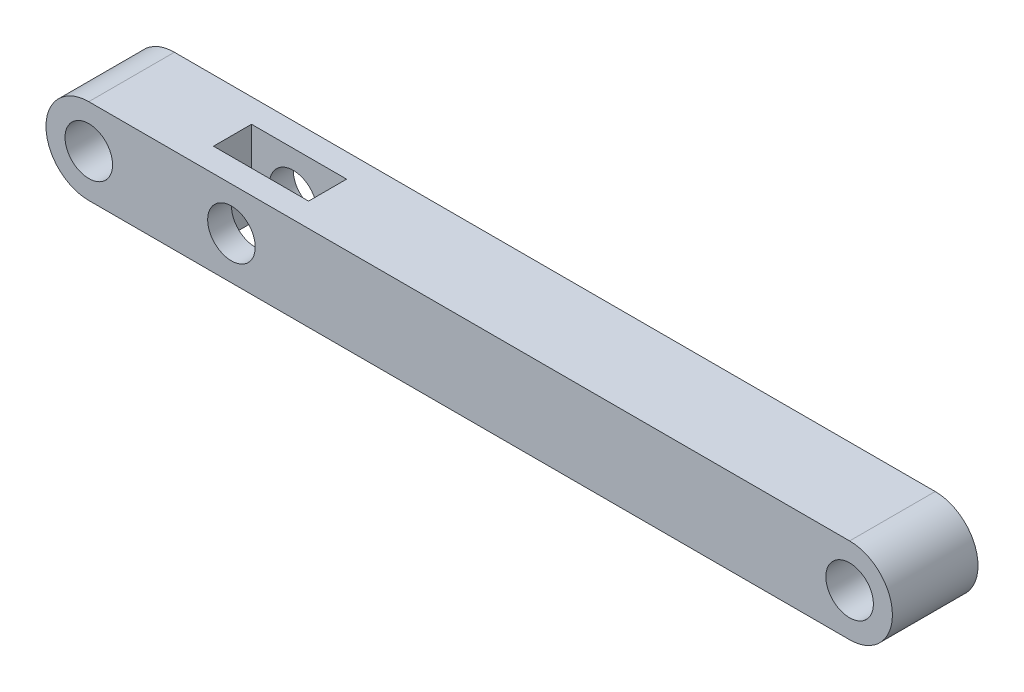
ISO-10303-21;
HEADER;
FILE_DESCRIPTION(('STEP AP214'),'2;1');
FILE_NAME('part.step','',(''),(''),'','','');
FILE_SCHEMA(('AUTOMOTIVE_DESIGN { 1 0 10303 214 1 1 1 1 }'));
ENDSEC;
DATA;
#1=APPLICATION_CONTEXT('core data for automotive mechanical design processes');
#2=APPLICATION_PROTOCOL_DEFINITION('international standard','automotive_design',2000,#1);
#3=PRODUCT_CONTEXT('',#1,'mechanical');
#4=PRODUCT('Part','Part','',(#3));
#5=PRODUCT_RELATED_PRODUCT_CATEGORY('part','',(#4));
#6=PRODUCT_DEFINITION_FORMATION('','',#4);
#7=PRODUCT_DEFINITION_CONTEXT('part definition',#1,'design');
#8=PRODUCT_DEFINITION('design','',#6,#7);
#9=PRODUCT_DEFINITION_SHAPE('','',#8);
#10=(LENGTH_UNIT() NAMED_UNIT(*) SI_UNIT(.MILLI.,.METRE.));
#11=(NAMED_UNIT(*) PLANE_ANGLE_UNIT() SI_UNIT($,.RADIAN.));
#12=(NAMED_UNIT(*) SI_UNIT($,.STERADIAN.) SOLID_ANGLE_UNIT());
#13=UNCERTAINTY_MEASURE_WITH_UNIT(LENGTH_MEASURE(1.E-05),#10,'distance_accuracy_value','');
#14=(GEOMETRIC_REPRESENTATION_CONTEXT(3) GLOBAL_UNCERTAINTY_ASSIGNED_CONTEXT((#13)) GLOBAL_UNIT_ASSIGNED_CONTEXT((#10,
#11,#12)) REPRESENTATION_CONTEXT('',''));
#15=CARTESIAN_POINT('',(0.,0.,0.));
#16=DIRECTION('',(0.,0.,1.));
#17=DIRECTION('',(1.,0.,0.));
#18=AXIS2_PLACEMENT_3D('',#15,#16,#17);
#19=CARTESIAN_POINT('',(0.,0.,18.));
#20=DIRECTION('',(0.,0.,-1.));
#21=DIRECTION('',(-1.,0.,0.));
#22=AXIS2_PLACEMENT_3D('',#19,#20,#21);
#23=CYLINDRICAL_SURFACE('',#22,5.);
#24=CARTESIAN_POINT('',(0.,0.,5.));
#25=DIRECTION('',(0.,0.,-1.));
#26=DIRECTION('',(-1.,0.,0.));
#27=AXIS2_PLACEMENT_3D('',#24,#25,#26);
#28=CIRCLE('',#27,5.);
#29=CARTESIAN_POINT('',(-5.,0.,5.));
#30=VERTEX_POINT('',#29);
#31=EDGE_CURVE('E36',#30,#30,#28,.T.);
#32=ORIENTED_EDGE('',*,*,#31,.F.);
#33=EDGE_LOOP('',(#32));
#34=FACE_BOUND('',#33,.T.);
#35=CARTESIAN_POINT('',(0.,0.,0.));
#36=DIRECTION('',(0.,0.,1.));
#37=DIRECTION('',(1.,0.,0.));
#38=AXIS2_PLACEMENT_3D('',#35,#36,#37);
#39=CIRCLE('',#38,5.);
#40=CARTESIAN_POINT('',(5.,0.,0.));
#41=VERTEX_POINT('',#40);
#42=EDGE_CURVE('E146',#41,#41,#39,.T.);
#43=ORIENTED_EDGE('',*,*,#42,.F.);
#44=EDGE_LOOP('',(#43));
#45=FACE_BOUND('',#44,.T.);
#46=ADVANCED_FACE('F32',(#34,#45),#23,.F.);
#47=CARTESIAN_POINT('',(-30.,0.,18.));
#48=DIRECTION('',(0.,0.,1.));
#49=DIRECTION('',(1.,0.,0.));
#50=AXIS2_PLACEMENT_3D('',#47,#48,#49);
#51=PLANE('',#50);
#52=CARTESIAN_POINT('',(130.,0.,18.));
#53=DIRECTION('',(0.,0.,1.));
#54=DIRECTION('',(1.,0.,0.));
#55=AXIS2_PLACEMENT_3D('',#52,#53,#54);
#56=CIRCLE('',#55,4.99999999999999);
#57=CARTESIAN_POINT('',(135.,0.,18.));
#58=VERTEX_POINT('',#57);
#59=EDGE_CURVE('E143',#58,#58,#56,.T.);
#60=ORIENTED_EDGE('',*,*,#59,.F.);
#61=EDGE_LOOP('',(#60));
#62=FACE_BOUND('',#61,.T.);
#63=CARTESIAN_POINT('',(-30.,0.,18.));
#64=DIRECTION('',(0.,0.,1.));
#65=DIRECTION('',(1.,0.,0.));
#66=AXIS2_PLACEMENT_3D('',#63,#64,#65);
#67=CIRCLE('',#66,9.);
#68=CARTESIAN_POINT('',(-30.,9.,18.));
#69=VERTEX_POINT('',#68);
#70=CARTESIAN_POINT('',(-30.,-9.,18.));
#71=VERTEX_POINT('',#70);
#72=EDGE_CURVE('E155',#69,#71,#67,.T.);
#73=ORIENTED_EDGE('',*,*,#72,.T.);
#74=DIRECTION('',(1.,0.,0.));
#75=VECTOR('',#74,1.);
#76=CARTESIAN_POINT('',(130.,-9.,18.));
#77=LINE('',#76,#75);
#78=CARTESIAN_POINT('',(130.,-9.,18.));
#79=VERTEX_POINT('',#78);
#80=EDGE_CURVE('E158',#71,#79,#77,.T.);
#81=ORIENTED_EDGE('',*,*,#80,.T.);
#82=CARTESIAN_POINT('',(130.,0.,18.));
#83=DIRECTION('',(0.,0.,1.));
#84=DIRECTION('',(1.,0.,0.));
#85=AXIS2_PLACEMENT_3D('',#82,#83,#84);
#86=CIRCLE('',#85,9.);
#87=CARTESIAN_POINT('',(130.,9.,18.));
#88=VERTEX_POINT('',#87);
#89=EDGE_CURVE('E161',#79,#88,#86,.T.);
#90=ORIENTED_EDGE('',*,*,#89,.T.);
#91=DIRECTION('',(-1.,0.,0.));
#92=VECTOR('',#91,1.);
#93=CARTESIAN_POINT('',(-30.,9.,18.));
#94=LINE('',#93,#92);
#95=EDGE_CURVE('E163',#88,#69,#94,.T.);
#96=ORIENTED_EDGE('',*,*,#95,.T.);
#97=EDGE_LOOP('',(#73,#81,#90,#96));
#98=FACE_BOUND('',#97,.T.);
#99=CARTESIAN_POINT('',(0.,0.,18.));
#100=DIRECTION('',(0.,0.,1.));
#101=DIRECTION('',(1.,0.,0.));
#102=AXIS2_PLACEMENT_3D('',#99,#100,#101);
#103=CIRCLE('',#102,5.);
#104=CARTESIAN_POINT('',(5.,0.,18.));
#105=VERTEX_POINT('',#104);
#106=EDGE_CURVE('E149',#105,#105,#103,.T.);
#107=ORIENTED_EDGE('',*,*,#106,.F.);
#108=EDGE_LOOP('',(#107));
#109=FACE_BOUND('',#108,.T.);
#110=CARTESIAN_POINT('',(-30.,0.,18.));
#111=DIRECTION('',(0.,0.,1.));
#112=DIRECTION('',(1.,0.,0.));
#113=AXIS2_PLACEMENT_3D('',#110,#111,#112);
#114=CIRCLE('',#113,5.);
#115=CARTESIAN_POINT('',(-25.,0.,18.));
#116=VERTEX_POINT('',#115);
#117=EDGE_CURVE('E136',#116,#116,#114,.T.);
#118=ORIENTED_EDGE('',*,*,#117,.F.);
#119=EDGE_LOOP('',(#118));
#120=FACE_BOUND('',#119,.T.);
#121=ADVANCED_FACE('F190',(#62,#98,#109,#120),#51,.T.);
#122=CARTESIAN_POINT('',(-30.,0.,0.));
#123=DIRECTION('',(0.,0.,1.));
#124=DIRECTION('',(1.,0.,0.));
#125=AXIS2_PLACEMENT_3D('',#122,#123,#124);
#126=PLANE('',#125);
#127=CARTESIAN_POINT('',(130.,0.,0.));
#128=DIRECTION('',(0.,0.,1.));
#129=DIRECTION('',(1.,0.,0.));
#130=AXIS2_PLACEMENT_3D('',#127,#128,#129);
#131=CIRCLE('',#130,4.99999999999999);
#132=CARTESIAN_POINT('',(135.,0.,0.));
#133=VERTEX_POINT('',#132);
#134=EDGE_CURVE('E139',#133,#133,#131,.T.);
#135=ORIENTED_EDGE('',*,*,#134,.T.);
#136=EDGE_LOOP('',(#135));
#137=FACE_BOUND('',#136,.T.);
#138=CARTESIAN_POINT('',(-30.,0.,0.));
#139=DIRECTION('',(0.,0.,1.));
#140=DIRECTION('',(1.,0.,0.));
#141=AXIS2_PLACEMENT_3D('',#138,#139,#140);
#142=CIRCLE('',#141,9.);
#143=CARTESIAN_POINT('',(-30.,9.,0.));
#144=VERTEX_POINT('',#143);
#145=CARTESIAN_POINT('',(-30.,-9.,0.));
#146=VERTEX_POINT('',#145);
#147=EDGE_CURVE('E152',#144,#146,#142,.T.);
#148=ORIENTED_EDGE('',*,*,#147,.F.);
#149=DIRECTION('',(-1.,0.,0.));
#150=VECTOR('',#149,1.);
#151=CARTESIAN_POINT('',(-30.,9.,0.));
#152=LINE('',#151,#150);
#153=CARTESIAN_POINT('',(130.,9.,0.));
#154=VERTEX_POINT('',#153);
#155=EDGE_CURVE('E159',#154,#144,#152,.T.);
#156=ORIENTED_EDGE('',*,*,#155,.F.);
#157=CARTESIAN_POINT('',(130.,0.,0.));
#158=DIRECTION('',(0.,0.,1.));
#159=DIRECTION('',(1.,0.,0.));
#160=AXIS2_PLACEMENT_3D('',#157,#158,#159);
#161=CIRCLE('',#160,9.);
#162=CARTESIAN_POINT('',(130.,-9.,0.));
#163=VERTEX_POINT('',#162);
#164=EDGE_CURVE('E170',#163,#154,#161,.T.);
#165=ORIENTED_EDGE('',*,*,#164,.F.);
#166=DIRECTION('',(1.,0.,0.));
#167=VECTOR('',#166,1.);
#168=CARTESIAN_POINT('',(130.,-9.,0.));
#169=LINE('',#168,#167);
#170=EDGE_CURVE('E168',#146,#163,#169,.T.);
#171=ORIENTED_EDGE('',*,*,#170,.F.);
#172=EDGE_LOOP('',(#148,#156,#165,#171));
#173=FACE_BOUND('',#172,.T.);
#174=ORIENTED_EDGE('',*,*,#42,.T.);
#175=EDGE_LOOP('',(#174));
#176=FACE_BOUND('',#175,.T.);
#177=CARTESIAN_POINT('',(-30.,0.,0.));
#178=DIRECTION('',(0.,0.,1.));
#179=DIRECTION('',(1.,0.,0.));
#180=AXIS2_PLACEMENT_3D('',#177,#178,#179);
#181=CIRCLE('',#180,5.);
#182=CARTESIAN_POINT('',(-25.,0.,0.));
#183=VERTEX_POINT('',#182);
#184=EDGE_CURVE('E140',#183,#183,#181,.T.);
#185=ORIENTED_EDGE('',*,*,#184,.T.);
#186=EDGE_LOOP('',(#185));
#187=FACE_BOUND('',#186,.T.);
#188=ADVANCED_FACE('F195',(#137,#173,#176,#187),#126,.F.);
#189=CARTESIAN_POINT('',(-30.,0.,18.));
#190=DIRECTION('',(0.,0.,-1.));
#191=DIRECTION('',(-1.,0.,0.));
#192=AXIS2_PLACEMENT_3D('',#189,#190,#191);
#193=CYLINDRICAL_SURFACE('',#192,9.);
#194=ORIENTED_EDGE('',*,*,#147,.T.);
#195=DIRECTION('',(0.,0.,-1.));
#196=VECTOR('',#195,1.);
#197=CARTESIAN_POINT('',(-30.,-9.,18.));
#198=LINE('',#197,#196);
#199=EDGE_CURVE('E11',#71,#146,#198,.T.);
#200=ORIENTED_EDGE('',*,*,#199,.F.);
#201=ORIENTED_EDGE('',*,*,#72,.F.);
#202=DIRECTION('',(0.,0.,-1.));
#203=VECTOR('',#202,1.);
#204=CARTESIAN_POINT('',(-30.,9.,18.));
#205=LINE('',#204,#203);
#206=EDGE_CURVE('E165',#69,#144,#205,.T.);
#207=ORIENTED_EDGE('',*,*,#206,.T.);
#208=EDGE_LOOP('',(#194,#200,#201,#207));
#209=FACE_BOUND('',#208,.T.);
#210=ADVANCED_FACE('F34',(#209),#193,.T.);
#211=CARTESIAN_POINT('',(130.,-9.,18.));
#212=DIRECTION('',(0.,1.,0.));
#213=DIRECTION('',(0.,0.,1.));
#214=AXIS2_PLACEMENT_3D('',#211,#212,#213);
#215=PLANE('',#214);
#216=DIRECTION('',(-1.,0.,0.));
#217=VECTOR('',#216,1.);
#218=CARTESIAN_POINT('',(-8.77792051619153,-9.,5.));
#219=LINE('',#218,#217);
#220=CARTESIAN_POINT('',(11.2220794838085,-9.,5.));
#221=VERTEX_POINT('',#220);
#222=CARTESIAN_POINT('',(-8.77792051619153,-9.,5.));
#223=VERTEX_POINT('',#222);
#224=EDGE_CURVE('E107',#221,#223,#219,.T.);
#225=ORIENTED_EDGE('',*,*,#224,.T.);
#226=DIRECTION('',(0.,0.,1.));
#227=VECTOR('',#226,1.);
#228=CARTESIAN_POINT('',(-8.77792051619153,-9.,5.));
#229=LINE('',#228,#227);
#230=CARTESIAN_POINT('',(-8.77792051619153,-9.,13.));
#231=VERTEX_POINT('',#230);
#232=EDGE_CURVE('E101',#223,#231,#229,.T.);
#233=ORIENTED_EDGE('',*,*,#232,.T.);
#234=DIRECTION('',(1.,0.,0.));
#235=VECTOR('',#234,1.);
#236=CARTESIAN_POINT('',(-8.77792051619153,-9.,13.));
#237=LINE('',#236,#235);
#238=CARTESIAN_POINT('',(11.2220794838085,-9.,13.));
#239=VERTEX_POINT('',#238);
#240=EDGE_CURVE('E110',#231,#239,#237,.T.);
#241=ORIENTED_EDGE('',*,*,#240,.T.);
#242=DIRECTION('',(0.,0.,-1.));
#243=VECTOR('',#242,1.);
#244=CARTESIAN_POINT('',(11.2220794838085,-9.,5.));
#245=LINE('',#244,#243);
#246=EDGE_CURVE('E49',#239,#221,#245,.T.);
#247=ORIENTED_EDGE('',*,*,#246,.T.);
#248=EDGE_LOOP('',(#225,#233,#241,#247));
#249=FACE_BOUND('',#248,.T.);
#250=ORIENTED_EDGE('',*,*,#170,.T.);
#251=DIRECTION('',(0.,0.,-1.));
#252=VECTOR('',#251,1.);
#253=CARTESIAN_POINT('',(130.,-9.,18.));
#254=LINE('',#253,#252);
#255=EDGE_CURVE('E41',#79,#163,#254,.T.);
#256=ORIENTED_EDGE('',*,*,#255,.F.);
#257=ORIENTED_EDGE('',*,*,#80,.F.);
#258=ORIENTED_EDGE('',*,*,#199,.T.);
#259=EDGE_LOOP('',(#250,#256,#257,#258));
#260=FACE_BOUND('',#259,.T.);
#261=ADVANCED_FACE('F114',(#249,#260),#215,.F.);
#262=CARTESIAN_POINT('',(130.,0.,18.));
#263=DIRECTION('',(0.,0.,-1.));
#264=DIRECTION('',(-1.,0.,0.));
#265=AXIS2_PLACEMENT_3D('',#262,#263,#264);
#266=CYLINDRICAL_SURFACE('',#265,9.);
#267=ORIENTED_EDGE('',*,*,#164,.T.);
#268=DIRECTION('',(0.,0.,-1.));
#269=VECTOR('',#268,1.);
#270=CARTESIAN_POINT('',(130.,9.,18.));
#271=LINE('',#270,#269);
#272=EDGE_CURVE('E175',#88,#154,#271,.T.);
#273=ORIENTED_EDGE('',*,*,#272,.F.);
#274=ORIENTED_EDGE('',*,*,#89,.F.);
#275=ORIENTED_EDGE('',*,*,#255,.T.);
#276=EDGE_LOOP('',(#267,#273,#274,#275));
#277=FACE_BOUND('',#276,.T.);
#278=ADVANCED_FACE('F224',(#277),#266,.T.);
#279=CARTESIAN_POINT('',(-30.,9.,18.));
#280=DIRECTION('',(0.,-1.,0.));
#281=DIRECTION('',(0.,0.,-1.));
#282=AXIS2_PLACEMENT_3D('',#279,#280,#281);
#283=PLANE('',#282);
#284=DIRECTION('',(1.,0.,0.));
#285=VECTOR('',#284,1.);
#286=CARTESIAN_POINT('',(-8.77792051619153,9.,13.));
#287=LINE('',#286,#285);
#288=CARTESIAN_POINT('',(-8.77792051619153,9.,13.));
#289=VERTEX_POINT('',#288);
#290=CARTESIAN_POINT('',(11.2220794838085,9.,13.));
#291=VERTEX_POINT('',#290);
#292=EDGE_CURVE('E126',#289,#291,#287,.T.);
#293=ORIENTED_EDGE('',*,*,#292,.F.);
#294=DIRECTION('',(0.,0.,1.));
#295=VECTOR('',#294,1.);
#296=CARTESIAN_POINT('',(-8.77792051619153,9.,5.));
#297=LINE('',#296,#295);
#298=CARTESIAN_POINT('',(-8.77792051619153,9.,5.));
#299=VERTEX_POINT('',#298);
#300=EDGE_CURVE('E57',#299,#289,#297,.T.);
#301=ORIENTED_EDGE('',*,*,#300,.F.);
#302=DIRECTION('',(-1.,0.,0.));
#303=VECTOR('',#302,1.);
#304=CARTESIAN_POINT('',(-8.77792051619153,9.,5.));
#305=LINE('',#304,#303);
#306=CARTESIAN_POINT('',(11.2220794838085,9.,5.));
#307=VERTEX_POINT('',#306);
#308=EDGE_CURVE('E117',#307,#299,#305,.T.);
#309=ORIENTED_EDGE('',*,*,#308,.F.);
#310=DIRECTION('',(0.,0.,-1.));
#311=VECTOR('',#310,1.);
#312=CARTESIAN_POINT('',(11.2220794838085,9.,5.));
#313=LINE('',#312,#311);
#314=EDGE_CURVE('E120',#291,#307,#313,.T.);
#315=ORIENTED_EDGE('',*,*,#314,.F.);
#316=EDGE_LOOP('',(#293,#301,#309,#315));
#317=FACE_BOUND('',#316,.T.);
#318=ORIENTED_EDGE('',*,*,#155,.T.);
#319=ORIENTED_EDGE('',*,*,#206,.F.);
#320=ORIENTED_EDGE('',*,*,#95,.F.);
#321=ORIENTED_EDGE('',*,*,#272,.T.);
#322=EDGE_LOOP('',(#318,#319,#320,#321));
#323=FACE_BOUND('',#322,.T.);
#324=ADVANCED_FACE('F217',(#317,#323),#283,.F.);
#325=CARTESIAN_POINT('',(0.,0.,13.));
#326=DIRECTION('',(0.,0.,1.));
#327=DIRECTION('',(1.,0.,0.));
#328=AXIS2_PLACEMENT_3D('',#325,#326,#327);
#329=CIRCLE('',#328,5.);
#330=CARTESIAN_POINT('',(5.,0.,13.));
#331=VERTEX_POINT('',#330);
#332=EDGE_CURVE('E132',#331,#331,#329,.T.);
#333=ORIENTED_EDGE('',*,*,#332,.F.);
#334=EDGE_LOOP('',(#333));
#335=FACE_BOUND('',#334,.T.);
#336=ORIENTED_EDGE('',*,*,#106,.T.);
#337=EDGE_LOOP('',(#336));
#338=FACE_BOUND('',#337,.T.);
#339=ADVANCED_FACE('F192',(#335,#338),#23,.F.);
#340=CARTESIAN_POINT('',(130.,0.,18.));
#341=DIRECTION('',(0.,0.,-1.));
#342=DIRECTION('',(-1.,0.,0.));
#343=AXIS2_PLACEMENT_3D('',#340,#341,#342);
#344=CYLINDRICAL_SURFACE('',#343,4.99999999999999);
#345=ORIENTED_EDGE('',*,*,#59,.T.);
#346=EDGE_LOOP('',(#345));
#347=FACE_BOUND('',#346,.T.);
#348=ORIENTED_EDGE('',*,*,#134,.F.);
#349=EDGE_LOOP('',(#348));
#350=FACE_BOUND('',#349,.T.);
#351=ADVANCED_FACE('F204',(#347,#350),#344,.F.);
#352=CARTESIAN_POINT('',(-30.,0.,18.));
#353=DIRECTION('',(0.,0.,-1.));
#354=DIRECTION('',(-1.,0.,0.));
#355=AXIS2_PLACEMENT_3D('',#352,#353,#354);
#356=CYLINDRICAL_SURFACE('',#355,5.);
#357=ORIENTED_EDGE('',*,*,#117,.T.);
#358=EDGE_LOOP('',(#357));
#359=FACE_BOUND('',#358,.T.);
#360=ORIENTED_EDGE('',*,*,#184,.F.);
#361=EDGE_LOOP('',(#360));
#362=FACE_BOUND('',#361,.T.);
#363=ADVANCED_FACE('F202',(#359,#362),#356,.F.);
#364=CARTESIAN_POINT('',(-8.77792051619153,-9.,5.));
#365=DIRECTION('',(-1.,0.,0.));
#366=DIRECTION('',(0.,0.,1.));
#367=AXIS2_PLACEMENT_3D('',#364,#365,#366);
#368=PLANE('',#367);
#369=ORIENTED_EDGE('',*,*,#300,.T.);
#370=DIRECTION('',(0.,1.,0.));
#371=VECTOR('',#370,1.);
#372=CARTESIAN_POINT('',(-8.77792051619153,-9.,13.));
#373=LINE('',#372,#371);
#374=EDGE_CURVE('E97',#231,#289,#373,.T.);
#375=ORIENTED_EDGE('',*,*,#374,.F.);
#376=ORIENTED_EDGE('',*,*,#232,.F.);
#377=DIRECTION('',(0.,1.,0.));
#378=VECTOR('',#377,1.);
#379=CARTESIAN_POINT('',(-8.77792051619153,-9.,5.));
#380=LINE('',#379,#378);
#381=EDGE_CURVE('E130',#223,#299,#380,.T.);
#382=ORIENTED_EDGE('',*,*,#381,.T.);
#383=EDGE_LOOP('',(#369,#375,#376,#382));
#384=FACE_BOUND('',#383,.T.);
#385=ADVANCED_FACE('F99',(#384),#368,.F.);
#386=CARTESIAN_POINT('',(-8.77792051619153,-9.,5.));
#387=DIRECTION('',(0.,0.,-1.));
#388=DIRECTION('',(-1.,0.,0.));
#389=AXIS2_PLACEMENT_3D('',#386,#387,#388);
#390=PLANE('',#389);
#391=ORIENTED_EDGE('',*,*,#31,.T.);
#392=EDGE_LOOP('',(#391));
#393=FACE_BOUND('',#392,.T.);
#394=ORIENTED_EDGE('',*,*,#308,.T.);
#395=ORIENTED_EDGE('',*,*,#381,.F.);
#396=ORIENTED_EDGE('',*,*,#224,.F.);
#397=DIRECTION('',(0.,1.,0.));
#398=VECTOR('',#397,1.);
#399=CARTESIAN_POINT('',(11.2220794838085,-9.,5.));
#400=LINE('',#399,#398);
#401=EDGE_CURVE('E133',#221,#307,#400,.T.);
#402=ORIENTED_EDGE('',*,*,#401,.T.);
#403=EDGE_LOOP('',(#394,#395,#396,#402));
#404=FACE_BOUND('',#403,.T.);
#405=ADVANCED_FACE('F185',(#393,#404),#390,.F.);
#406=CARTESIAN_POINT('',(11.2220794838085,-9.,5.));
#407=DIRECTION('',(1.,0.,0.));
#408=DIRECTION('',(0.,0.,-1.));
#409=AXIS2_PLACEMENT_3D('',#406,#407,#408);
#410=PLANE('',#409);
#411=ORIENTED_EDGE('',*,*,#314,.T.);
#412=ORIENTED_EDGE('',*,*,#401,.F.);
#413=ORIENTED_EDGE('',*,*,#246,.F.);
#414=DIRECTION('',(0.,1.,0.));
#415=VECTOR('',#414,1.);
#416=CARTESIAN_POINT('',(11.2220794838085,-9.,13.));
#417=LINE('',#416,#415);
#418=EDGE_CURVE('E106',#239,#291,#417,.T.);
#419=ORIENTED_EDGE('',*,*,#418,.T.);
#420=EDGE_LOOP('',(#411,#412,#413,#419));
#421=FACE_BOUND('',#420,.T.);
#422=ADVANCED_FACE('F302',(#421),#410,.F.);
#423=CARTESIAN_POINT('',(-8.77792051619153,-9.,13.));
#424=DIRECTION('',(0.,0.,1.));
#425=DIRECTION('',(1.,0.,0.));
#426=AXIS2_PLACEMENT_3D('',#423,#424,#425);
#427=PLANE('',#426);
#428=ORIENTED_EDGE('',*,*,#332,.T.);
#429=EDGE_LOOP('',(#428));
#430=FACE_BOUND('',#429,.T.);
#431=ORIENTED_EDGE('',*,*,#292,.T.);
#432=ORIENTED_EDGE('',*,*,#418,.F.);
#433=ORIENTED_EDGE('',*,*,#240,.F.);
#434=ORIENTED_EDGE('',*,*,#374,.T.);
#435=EDGE_LOOP('',(#431,#432,#433,#434));
#436=FACE_BOUND('',#435,.T.);
#437=ADVANCED_FACE('F111',(#430,#436),#427,.F.);
#438=CLOSED_SHELL('',(#46,#121,#188,#210,#261,#278,#324,#339,#351,#363,#385,#405,#422,#437));
#439=MANIFOLD_SOLID_BREP('B2',#438);
#440=ADVANCED_BREP_SHAPE_REPRESENTATION('',(#18,#439),#14);
#441=SHAPE_DEFINITION_REPRESENTATION(#9,#440);
ENDSEC;
END-ISO-10303-21;
